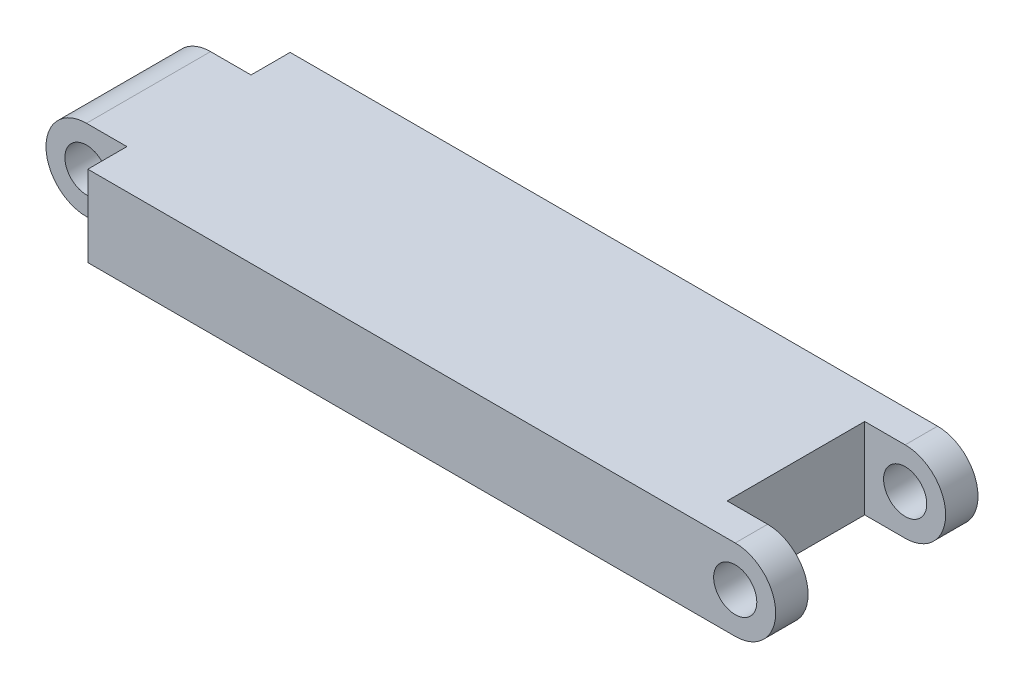
ISO-10303-21;
HEADER;
FILE_DESCRIPTION(('STEP AP214'),'2;1');
FILE_NAME('part.step','',(''),(''),'','','');
FILE_SCHEMA(('AUTOMOTIVE_DESIGN { 1 0 10303 214 1 1 1 1 }'));
ENDSEC;
DATA;
#1=APPLICATION_CONTEXT('core data for automotive mechanical design processes');
#2=APPLICATION_PROTOCOL_DEFINITION('international standard','automotive_design',2000,#1);
#3=PRODUCT_CONTEXT('',#1,'mechanical');
#4=PRODUCT('Part','Part','',(#3));
#5=PRODUCT_RELATED_PRODUCT_CATEGORY('part','',(#4));
#6=PRODUCT_DEFINITION_FORMATION('','',#4);
#7=PRODUCT_DEFINITION_CONTEXT('part definition',#1,'design');
#8=PRODUCT_DEFINITION('design','',#6,#7);
#9=PRODUCT_DEFINITION_SHAPE('','',#8);
#10=(LENGTH_UNIT() NAMED_UNIT(*) SI_UNIT(.MILLI.,.METRE.));
#11=(NAMED_UNIT(*) PLANE_ANGLE_UNIT() SI_UNIT($,.RADIAN.));
#12=(NAMED_UNIT(*) SI_UNIT($,.STERADIAN.) SOLID_ANGLE_UNIT());
#13=UNCERTAINTY_MEASURE_WITH_UNIT(LENGTH_MEASURE(1.E-05),#10,'distance_accuracy_value','');
#14=(GEOMETRIC_REPRESENTATION_CONTEXT(3) GLOBAL_UNCERTAINTY_ASSIGNED_CONTEXT((#13)) GLOBAL_UNIT_ASSIGNED_CONTEXT((#10,
#11,#12)) REPRESENTATION_CONTEXT('',''));
#15=CARTESIAN_POINT('',(0.,0.,0.));
#16=DIRECTION('',(0.,0.,1.));
#17=DIRECTION('',(1.,0.,0.));
#18=AXIS2_PLACEMENT_3D('',#15,#16,#17);
#19=CARTESIAN_POINT('',(-20.2474402730375,3.,-15.2941979522184));
#20=DIRECTION('',(0.,0.,1.));
#21=DIRECTION('',(1.,0.,0.));
#22=AXIS2_PLACEMENT_3D('',#19,#20,#21);
#23=CYLINDRICAL_SURFACE('',#22,1.6);
#24=CARTESIAN_POINT('',(-20.2474402730375,3.,1.2058020477816));
#25=DIRECTION('',(0.,0.,-1.));
#26=DIRECTION('',(-1.,0.,0.));
#27=AXIS2_PLACEMENT_3D('',#24,#25,#26);
#28=CIRCLE('',#27,1.6);
#29=CARTESIAN_POINT('',(-21.8474402730375,3.,1.2058020477816));
#30=VERTEX_POINT('',#29);
#31=EDGE_CURVE('E228',#30,#30,#28,.F.);
#32=ORIENTED_EDGE('',*,*,#31,.T.);
#33=EDGE_LOOP('',(#32));
#34=FACE_BOUND('',#33,.T.);
#35=CARTESIAN_POINT('',(-20.2474402730375,3.,-7.9941979522184));
#36=DIRECTION('',(0.,0.,-1.));
#37=DIRECTION('',(-1.,0.,0.));
#38=AXIS2_PLACEMENT_3D('',#35,#36,#37);
#39=CIRCLE('',#38,1.6);
#40=CARTESIAN_POINT('',(-21.8474402730375,3.,-7.9941979522184));
#41=VERTEX_POINT('',#40);
#42=EDGE_CURVE('E241',#41,#41,#39,.F.);
#43=ORIENTED_EDGE('',*,*,#42,.F.);
#44=EDGE_LOOP('',(#43));
#45=FACE_BOUND('',#44,.T.);
#46=ADVANCED_FACE('F104',(#34,#45),#23,.F.);
#47=CARTESIAN_POINT('',(-20.2474402730375,3.,-15.2941979522184));
#48=DIRECTION('',(0.,0.,1.));
#49=DIRECTION('',(1.,0.,0.));
#50=AXIS2_PLACEMENT_3D('',#47,#48,#49);
#51=CYLINDRICAL_SURFACE('',#50,3.);
#52=CARTESIAN_POINT('',(-20.2474402730375,3.,1.2058020477816));
#53=DIRECTION('',(0.,0.,-1.));
#54=DIRECTION('',(-1.,0.,0.));
#55=AXIS2_PLACEMENT_3D('',#52,#53,#54);
#56=CIRCLE('',#55,3.);
#57=CARTESIAN_POINT('',(-20.2474402730375,0.,1.2058020477816));
#58=VERTEX_POINT('',#57);
#59=CARTESIAN_POINT('',(-20.2474402730375,6.,1.2058020477816));
#60=VERTEX_POINT('',#59);
#61=EDGE_CURVE('E223',#58,#60,#56,.T.);
#62=ORIENTED_EDGE('',*,*,#61,.T.);
#63=DIRECTION('',(0.,0.,1.));
#64=VECTOR('',#63,1.);
#65=CARTESIAN_POINT('',(-20.2474402730375,6.,-15.2941979522184));
#66=LINE('',#65,#64);
#67=CARTESIAN_POINT('',(-20.2474402730375,6.,-7.9941979522184));
#68=VERTEX_POINT('',#67);
#69=EDGE_CURVE('E204',#68,#60,#66,.T.);
#70=ORIENTED_EDGE('',*,*,#69,.F.);
#71=CARTESIAN_POINT('',(-20.2474402730375,3.,-7.9941979522184));
#72=DIRECTION('',(0.,0.,-1.));
#73=DIRECTION('',(-1.,0.,0.));
#74=AXIS2_PLACEMENT_3D('',#71,#72,#73);
#75=CIRCLE('',#74,3.);
#76=CARTESIAN_POINT('',(-20.2474402730375,0.,-7.9941979522184));
#77=VERTEX_POINT('',#76);
#78=EDGE_CURVE('E12',#77,#68,#75,.T.);
#79=ORIENTED_EDGE('',*,*,#78,.F.);
#80=DIRECTION('',(0.,0.,1.));
#81=VECTOR('',#80,1.);
#82=CARTESIAN_POINT('',(-20.2474402730375,0.,-15.2941979522184));
#83=LINE('',#82,#81);
#84=EDGE_CURVE('E245',#77,#58,#83,.T.);
#85=ORIENTED_EDGE('',*,*,#84,.T.);
#86=EDGE_LOOP('',(#62,#70,#79,#85));
#87=FACE_BOUND('',#86,.T.);
#88=ADVANCED_FACE('F368',(#87),#51,.T.);
#89=CARTESIAN_POINT('',(-23.2474402730375,6.,4.1058020477816));
#90=DIRECTION('',(0.,0.,-1.));
#91=DIRECTION('',(-1.,0.,0.));
#92=AXIS2_PLACEMENT_3D('',#89,#90,#91);
#93=PLANE('',#92);
#94=CARTESIAN_POINT('',(30.7525597269625,3.,4.1058020477816));
#95=DIRECTION('',(0.,0.,1.));
#96=DIRECTION('',(1.,0.,0.));
#97=AXIS2_PLACEMENT_3D('',#94,#95,#96);
#98=CIRCLE('',#97,1.6);
#99=CARTESIAN_POINT('',(32.3525597269625,3.,4.1058020477816));
#100=VERTEX_POINT('',#99);
#101=EDGE_CURVE('E280',#100,#100,#98,.T.);
#102=ORIENTED_EDGE('',*,*,#101,.F.);
#103=EDGE_LOOP('',(#102));
#104=FACE_BOUND('',#103,.T.);
#105=DIRECTION('',(1.,0.,0.));
#106=VECTOR('',#105,1.);
#107=CARTESIAN_POINT('',(-23.2474402730375,6.,4.1058020477816));
#108=LINE('',#107,#106);
#109=CARTESIAN_POINT('',(-17.2474402730375,6.,4.1058020477816));
#110=VERTEX_POINT('',#109);
#111=CARTESIAN_POINT('',(30.7525597269625,6.,4.1058020477816));
#112=VERTEX_POINT('',#111);
#113=EDGE_CURVE('E329',#110,#112,#108,.T.);
#114=ORIENTED_EDGE('',*,*,#113,.F.);
#115=DIRECTION('',(0.,1.,0.));
#116=VECTOR('',#115,1.);
#117=CARTESIAN_POINT('',(-17.2474402730375,-11.,4.1058020477816));
#118=LINE('',#117,#116);
#119=CARTESIAN_POINT('',(-17.2474402730375,0.,4.1058020477816));
#120=VERTEX_POINT('',#119);
#121=EDGE_CURVE('E199',#120,#110,#118,.T.);
#122=ORIENTED_EDGE('',*,*,#121,.F.);
#123=DIRECTION('',(1.,0.,0.));
#124=VECTOR('',#123,1.);
#125=CARTESIAN_POINT('',(-23.2474402730375,0.,4.1058020477816));
#126=LINE('',#125,#124);
#127=CARTESIAN_POINT('',(30.7525597269625,0.,4.1058020477816));
#128=VERTEX_POINT('',#127);
#129=EDGE_CURVE('E326',#120,#128,#126,.T.);
#130=ORIENTED_EDGE('',*,*,#129,.T.);
#131=CARTESIAN_POINT('',(30.7525597269625,3.,4.1058020477816));
#132=DIRECTION('',(0.,0.,1.));
#133=DIRECTION('',(1.,0.,0.));
#134=AXIS2_PLACEMENT_3D('',#131,#132,#133);
#135=CIRCLE('',#134,3.);
#136=EDGE_CURVE('E272',#112,#128,#135,.F.);
#137=ORIENTED_EDGE('',*,*,#136,.F.);
#138=EDGE_LOOP('',(#114,#122,#130,#137));
#139=FACE_BOUND('',#138,.T.);
#140=ADVANCED_FACE('F106',(#104,#139),#93,.F.);
#141=CARTESIAN_POINT('',(-23.2474402730375,6.,-10.8941979522184));
#142=DIRECTION('',(0.,0.,1.));
#143=DIRECTION('',(1.,0.,0.));
#144=AXIS2_PLACEMENT_3D('',#141,#142,#143);
#145=PLANE('',#144);
#146=CARTESIAN_POINT('',(30.7525597269625,3.,-10.8941979522184));
#147=DIRECTION('',(0.,0.,1.));
#148=DIRECTION('',(1.,0.,0.));
#149=AXIS2_PLACEMENT_3D('',#146,#147,#148);
#150=CIRCLE('',#149,1.6);
#151=CARTESIAN_POINT('',(32.3525597269625,3.,-10.8941979522184));
#152=VERTEX_POINT('',#151);
#153=EDGE_CURVE('E289',#152,#152,#150,.T.);
#154=ORIENTED_EDGE('',*,*,#153,.T.);
#155=EDGE_LOOP('',(#154));
#156=FACE_BOUND('',#155,.T.);
#157=DIRECTION('',(-1.,0.,0.));
#158=VECTOR('',#157,1.);
#159=CARTESIAN_POINT('',(-23.2474402730375,0.,-10.8941979522184));
#160=LINE('',#159,#158);
#161=CARTESIAN_POINT('',(30.7525597269625,0.,-10.8941979522184));
#162=VERTEX_POINT('',#161);
#163=CARTESIAN_POINT('',(-17.2474402730375,0.,-10.8941979522184));
#164=VERTEX_POINT('',#163);
#165=EDGE_CURVE('E333',#162,#164,#160,.T.);
#166=ORIENTED_EDGE('',*,*,#165,.T.);
#167=DIRECTION('',(0.,1.,0.));
#168=VECTOR('',#167,1.);
#169=CARTESIAN_POINT('',(-17.2474402730375,-11.,-10.8941979522184));
#170=LINE('',#169,#168);
#171=CARTESIAN_POINT('',(-17.2474402730375,6.,-10.8941979522184));
#172=VERTEX_POINT('',#171);
#173=EDGE_CURVE('E254',#164,#172,#170,.T.);
#174=ORIENTED_EDGE('',*,*,#173,.T.);
#175=DIRECTION('',(-1.,0.,0.));
#176=VECTOR('',#175,1.);
#177=CARTESIAN_POINT('',(-23.2474402730375,6.,-10.8941979522184));
#178=LINE('',#177,#176);
#179=CARTESIAN_POINT('',(30.7525597269625,6.,-10.8941979522184));
#180=VERTEX_POINT('',#179);
#181=EDGE_CURVE('E332',#180,#172,#178,.T.);
#182=ORIENTED_EDGE('',*,*,#181,.F.);
#183=CARTESIAN_POINT('',(30.7525597269625,3.,-10.8941979522184));
#184=DIRECTION('',(0.,0.,1.));
#185=DIRECTION('',(1.,0.,0.));
#186=AXIS2_PLACEMENT_3D('',#183,#184,#185);
#187=CIRCLE('',#186,3.);
#188=EDGE_CURVE('E296',#180,#162,#187,.F.);
#189=ORIENTED_EDGE('',*,*,#188,.T.);
#190=EDGE_LOOP('',(#166,#174,#182,#189));
#191=FACE_BOUND('',#190,.T.);
#192=ADVANCED_FACE('F376',(#156,#191),#145,.F.);
#193=CARTESIAN_POINT('',(0.,0.,0.));
#194=DIRECTION('',(0.,1.,0.));
#195=DIRECTION('',(0.,0.,1.));
#196=AXIS2_PLACEMENT_3D('',#193,#194,#195);
#197=PLANE('',#196);
#198=DIRECTION('',(0.,0.,-1.));
#199=VECTOR('',#198,1.);
#200=CARTESIAN_POINT('',(-17.2474402730375,0.,0.));
#201=LINE('',#200,#199);
#202=CARTESIAN_POINT('',(-17.2474402730375,0.,1.2058020477816));
#203=VERTEX_POINT('',#202);
#204=EDGE_CURVE('E257',#120,#203,#201,.T.);
#205=ORIENTED_EDGE('',*,*,#204,.T.);
#206=DIRECTION('',(1.,0.,0.));
#207=VECTOR('',#206,1.);
#208=CARTESIAN_POINT('',(-17.2474402730375,0.,1.2058020477816));
#209=LINE('',#208,#207);
#210=EDGE_CURVE('E214',#58,#203,#209,.T.);
#211=ORIENTED_EDGE('',*,*,#210,.F.);
#212=ORIENTED_EDGE('',*,*,#84,.F.);
#213=DIRECTION('',(-1.,0.,0.));
#214=VECTOR('',#213,1.);
#215=CARTESIAN_POINT('',(-17.2474402730375,0.,-7.9941979522184));
#216=LINE('',#215,#214);
#217=CARTESIAN_POINT('',(-17.2474402730375,0.,-7.9941979522184));
#218=VERTEX_POINT('',#217);
#219=EDGE_CURVE('E119',#218,#77,#216,.T.);
#220=ORIENTED_EDGE('',*,*,#219,.F.);
#221=DIRECTION('',(0.,0.,-1.));
#222=VECTOR('',#221,1.);
#223=CARTESIAN_POINT('',(-17.2474402730375,0.,0.));
#224=LINE('',#223,#222);
#225=EDGE_CURVE('E263',#218,#164,#224,.T.);
#226=ORIENTED_EDGE('',*,*,#225,.T.);
#227=ORIENTED_EDGE('',*,*,#165,.F.);
#228=DIRECTION('',(0.,0.,1.));
#229=VECTOR('',#228,1.);
#230=CARTESIAN_POINT('',(30.7525597269625,0.,-12.8941979522184));
#231=LINE('',#230,#229);
#232=CARTESIAN_POINT('',(30.7525597269625,0.,-8.4941979522184));
#233=VERTEX_POINT('',#232);
#234=EDGE_CURVE('E271',#162,#233,#231,.T.);
#235=ORIENTED_EDGE('',*,*,#234,.T.);
#236=DIRECTION('',(-1.,0.,0.));
#237=VECTOR('',#236,1.);
#238=CARTESIAN_POINT('',(27.7525597269625,0.,-8.4941979522184));
#239=LINE('',#238,#237);
#240=CARTESIAN_POINT('',(27.7525597269625,0.,-8.4941979522184));
#241=VERTEX_POINT('',#240);
#242=EDGE_CURVE('E309',#233,#241,#239,.T.);
#243=ORIENTED_EDGE('',*,*,#242,.T.);
#244=DIRECTION('',(0.,0.,1.));
#245=VECTOR('',#244,1.);
#246=CARTESIAN_POINT('',(27.7525597269625,0.,-8.4941979522184));
#247=LINE('',#246,#245);
#248=CARTESIAN_POINT('',(27.7525597269625,0.,1.7058020477816));
#249=VERTEX_POINT('',#248);
#250=EDGE_CURVE('E300',#241,#249,#247,.T.);
#251=ORIENTED_EDGE('',*,*,#250,.T.);
#252=DIRECTION('',(1.,0.,0.));
#253=VECTOR('',#252,1.);
#254=CARTESIAN_POINT('',(27.7525597269625,0.,1.7058020477816));
#255=LINE('',#254,#253);
#256=CARTESIAN_POINT('',(30.7525597269625,0.,1.7058020477816));
#257=VERTEX_POINT('',#256);
#258=EDGE_CURVE('E304',#249,#257,#255,.T.);
#259=ORIENTED_EDGE('',*,*,#258,.T.);
#260=EDGE_CURVE('E267',#257,#128,#231,.T.);
#261=ORIENTED_EDGE('',*,*,#260,.T.);
#262=ORIENTED_EDGE('',*,*,#129,.F.);
#263=EDGE_LOOP('',(#205,#211,#212,#220,#226,#227,#235,#243,#251,#259,#261,#262));
#264=FACE_BOUND('',#263,.T.);
#265=ADVANCED_FACE('F356',(#264),#197,.F.);
#266=CARTESIAN_POINT('',(27.7525597269625,0.,-8.4941979522184));
#267=DIRECTION('',(0.,0.,-1.));
#268=DIRECTION('',(-1.,0.,0.));
#269=AXIS2_PLACEMENT_3D('',#266,#267,#268);
#270=PLANE('',#269);
#271=CARTESIAN_POINT('',(30.7525597269625,3.,-8.4941979522184));
#272=DIRECTION('',(0.,0.,-1.));
#273=DIRECTION('',(-1.,0.,0.));
#274=AXIS2_PLACEMENT_3D('',#271,#272,#273);
#275=CIRCLE('',#274,1.6);
#276=CARTESIAN_POINT('',(29.1525597269625,3.,-8.4941979522184));
#277=VERTEX_POINT('',#276);
#278=EDGE_CURVE('E285',#277,#277,#275,.T.);
#279=ORIENTED_EDGE('',*,*,#278,.T.);
#280=EDGE_LOOP('',(#279));
#281=FACE_BOUND('',#280,.T.);
#282=ORIENTED_EDGE('',*,*,#242,.F.);
#283=CARTESIAN_POINT('',(30.7525597269625,3.,-8.4941979522184));
#284=DIRECTION('',(0.,0.,-1.));
#285=DIRECTION('',(-1.,0.,0.));
#286=AXIS2_PLACEMENT_3D('',#283,#284,#285);
#287=CIRCLE('',#286,3.);
#288=CARTESIAN_POINT('',(30.7525597269625,6.,-8.4941979522184));
#289=VERTEX_POINT('',#288);
#290=EDGE_CURVE('E293',#233,#289,#287,.F.);
#291=ORIENTED_EDGE('',*,*,#290,.T.);
#292=DIRECTION('',(-1.,0.,0.));
#293=VECTOR('',#292,1.);
#294=CARTESIAN_POINT('',(27.7525597269625,6.,-8.4941979522184));
#295=LINE('',#294,#293);
#296=CARTESIAN_POINT('',(27.7525597269625,6.,-8.4941979522184));
#297=VERTEX_POINT('',#296);
#298=EDGE_CURVE('E305',#289,#297,#295,.T.);
#299=ORIENTED_EDGE('',*,*,#298,.T.);
#300=DIRECTION('',(0.,1.,0.));
#301=VECTOR('',#300,1.);
#302=CARTESIAN_POINT('',(27.7525597269625,0.,-8.4941979522184));
#303=LINE('',#302,#301);
#304=EDGE_CURVE('E322',#241,#297,#303,.T.);
#305=ORIENTED_EDGE('',*,*,#304,.F.);
#306=EDGE_LOOP('',(#282,#291,#299,#305));
#307=FACE_BOUND('',#306,.T.);
#308=ADVANCED_FACE('F381',(#281,#307),#270,.F.);
#309=CARTESIAN_POINT('',(27.7525597269625,0.,1.7058020477816));
#310=DIRECTION('',(0.,0.,1.));
#311=DIRECTION('',(1.,0.,0.));
#312=AXIS2_PLACEMENT_3D('',#309,#310,#311);
#313=PLANE('',#312);
#314=CARTESIAN_POINT('',(30.7525597269625,3.,1.7058020477816));
#315=DIRECTION('',(0.,0.,1.));
#316=DIRECTION('',(1.,0.,0.));
#317=AXIS2_PLACEMENT_3D('',#314,#315,#316);
#318=CIRCLE('',#317,1.6);
#319=CARTESIAN_POINT('',(32.3525597269625,3.,1.7058020477816));
#320=VERTEX_POINT('',#319);
#321=EDGE_CURVE('E284',#320,#320,#318,.T.);
#322=ORIENTED_EDGE('',*,*,#321,.T.);
#323=EDGE_LOOP('',(#322));
#324=FACE_BOUND('',#323,.T.);
#325=CARTESIAN_POINT('',(30.7525597269625,3.,1.7058020477816));
#326=DIRECTION('',(0.,0.,1.));
#327=DIRECTION('',(1.,0.,0.));
#328=AXIS2_PLACEMENT_3D('',#325,#326,#327);
#329=CIRCLE('',#328,3.);
#330=CARTESIAN_POINT('',(30.7525597269625,6.,1.7058020477816));
#331=VERTEX_POINT('',#330);
#332=EDGE_CURVE('E113',#331,#257,#329,.F.);
#333=ORIENTED_EDGE('',*,*,#332,.T.);
#334=ORIENTED_EDGE('',*,*,#258,.F.);
#335=DIRECTION('',(0.,1.,0.));
#336=VECTOR('',#335,1.);
#337=CARTESIAN_POINT('',(27.7525597269625,0.,1.7058020477816));
#338=LINE('',#337,#336);
#339=CARTESIAN_POINT('',(27.7525597269625,6.,1.7058020477816));
#340=VERTEX_POINT('',#339);
#341=EDGE_CURVE('E312',#249,#340,#338,.T.);
#342=ORIENTED_EDGE('',*,*,#341,.T.);
#343=DIRECTION('',(1.,0.,0.));
#344=VECTOR('',#343,1.);
#345=CARTESIAN_POINT('',(27.7525597269625,6.,1.7058020477816));
#346=LINE('',#345,#344);
#347=EDGE_CURVE('E316',#340,#331,#346,.T.);
#348=ORIENTED_EDGE('',*,*,#347,.T.);
#349=EDGE_LOOP('',(#333,#334,#342,#348));
#350=FACE_BOUND('',#349,.T.);
#351=ADVANCED_FACE('F348',(#324,#350),#313,.F.);
#352=CARTESIAN_POINT('',(0.,6.,0.));
#353=DIRECTION('',(0.,1.,0.));
#354=DIRECTION('',(0.,0.,1.));
#355=AXIS2_PLACEMENT_3D('',#352,#353,#354);
#356=PLANE('',#355);
#357=DIRECTION('',(-1.,0.,0.));
#358=VECTOR('',#357,1.);
#359=CARTESIAN_POINT('',(-17.2474402730375,6.,1.2058020477816));
#360=LINE('',#359,#358);
#361=CARTESIAN_POINT('',(-17.2474402730375,6.,1.2058020477816));
#362=VERTEX_POINT('',#361);
#363=EDGE_CURVE('E211',#362,#60,#360,.T.);
#364=ORIENTED_EDGE('',*,*,#363,.F.);
#365=DIRECTION('',(0.,0.,-1.));
#366=VECTOR('',#365,1.);
#367=CARTESIAN_POINT('',(-17.2474402730375,6.,4.1058020477816));
#368=LINE('',#367,#366);
#369=EDGE_CURVE('E194',#110,#362,#368,.T.);
#370=ORIENTED_EDGE('',*,*,#369,.F.);
#371=ORIENTED_EDGE('',*,*,#113,.T.);
#372=DIRECTION('',(0.,0.,1.));
#373=VECTOR('',#372,1.);
#374=CARTESIAN_POINT('',(30.7525597269625,6.,-12.8941979522184));
#375=LINE('',#374,#373);
#376=EDGE_CURVE('E276',#331,#112,#375,.T.);
#377=ORIENTED_EDGE('',*,*,#376,.F.);
#378=ORIENTED_EDGE('',*,*,#347,.F.);
#379=DIRECTION('',(0.,0.,1.));
#380=VECTOR('',#379,1.);
#381=CARTESIAN_POINT('',(27.7525597269625,6.,-8.4941979522184));
#382=LINE('',#381,#380);
#383=EDGE_CURVE('E299',#297,#340,#382,.T.);
#384=ORIENTED_EDGE('',*,*,#383,.F.);
#385=ORIENTED_EDGE('',*,*,#298,.F.);
#386=EDGE_CURVE('E127',#180,#289,#375,.T.);
#387=ORIENTED_EDGE('',*,*,#386,.F.);
#388=ORIENTED_EDGE('',*,*,#181,.T.);
#389=DIRECTION('',(0.,0.,-1.));
#390=VECTOR('',#389,1.);
#391=CARTESIAN_POINT('',(-17.2474402730375,6.,-10.8941979522184));
#392=LINE('',#391,#390);
#393=CARTESIAN_POINT('',(-17.2474402730375,6.,-7.9941979522184));
#394=VERTEX_POINT('',#393);
#395=EDGE_CURVE('E251',#394,#172,#392,.T.);
#396=ORIENTED_EDGE('',*,*,#395,.F.);
#397=DIRECTION('',(1.,0.,0.));
#398=VECTOR('',#397,1.);
#399=CARTESIAN_POINT('',(-17.2474402730375,6.,-7.9941979522184));
#400=LINE('',#399,#398);
#401=EDGE_CURVE('E237',#68,#394,#400,.T.);
#402=ORIENTED_EDGE('',*,*,#401,.F.);
#403=ORIENTED_EDGE('',*,*,#69,.T.);
#404=EDGE_LOOP('',(#364,#370,#371,#377,#378,#384,#385,#387,#388,#396,#402,#403));
#405=FACE_BOUND('',#404,.T.);
#406=ADVANCED_FACE('F217',(#405),#356,.T.);
#407=CARTESIAN_POINT('',(27.7525597269625,0.,-8.4941979522184));
#408=DIRECTION('',(-1.,0.,0.));
#409=DIRECTION('',(0.,0.,1.));
#410=AXIS2_PLACEMENT_3D('',#407,#408,#409);
#411=PLANE('',#410);
#412=ORIENTED_EDGE('',*,*,#383,.T.);
#413=ORIENTED_EDGE('',*,*,#341,.F.);
#414=ORIENTED_EDGE('',*,*,#250,.F.);
#415=ORIENTED_EDGE('',*,*,#304,.T.);
#416=EDGE_LOOP('',(#412,#413,#414,#415));
#417=FACE_BOUND('',#416,.T.);
#418=ADVANCED_FACE('F362',(#417),#411,.F.);
#419=CARTESIAN_POINT('',(30.7525597269625,3.,-12.8941979522184));
#420=DIRECTION('',(0.,0.,1.));
#421=DIRECTION('',(1.,0.,0.));
#422=AXIS2_PLACEMENT_3D('',#419,#420,#421);
#423=CYLINDRICAL_SURFACE('',#422,1.6);
#424=ORIENTED_EDGE('',*,*,#101,.T.);
#425=EDGE_LOOP('',(#424));
#426=FACE_BOUND('',#425,.T.);
#427=ORIENTED_EDGE('',*,*,#321,.F.);
#428=EDGE_LOOP('',(#427));
#429=FACE_BOUND('',#428,.T.);
#430=ADVANCED_FACE('F395',(#426,#429),#423,.F.);
#431=CARTESIAN_POINT('',(30.7525597269625,3.,-12.8941979522184));
#432=DIRECTION('',(0.,0.,1.));
#433=DIRECTION('',(1.,0.,0.));
#434=AXIS2_PLACEMENT_3D('',#431,#432,#433);
#435=CYLINDRICAL_SURFACE('',#434,3.);
#436=ORIENTED_EDGE('',*,*,#376,.T.);
#437=ORIENTED_EDGE('',*,*,#136,.T.);
#438=ORIENTED_EDGE('',*,*,#260,.F.);
#439=ORIENTED_EDGE('',*,*,#332,.F.);
#440=EDGE_LOOP('',(#436,#437,#438,#439));
#441=FACE_BOUND('',#440,.T.);
#442=ADVANCED_FACE('F352',(#441),#435,.T.);
#443=ORIENTED_EDGE('',*,*,#278,.F.);
#444=EDGE_LOOP('',(#443));
#445=FACE_BOUND('',#444,.T.);
#446=ORIENTED_EDGE('',*,*,#153,.F.);
#447=EDGE_LOOP('',(#446));
#448=FACE_BOUND('',#447,.T.);
#449=ADVANCED_FACE('F385',(#445,#448),#423,.F.);
#450=ORIENTED_EDGE('',*,*,#386,.T.);
#451=ORIENTED_EDGE('',*,*,#290,.F.);
#452=ORIENTED_EDGE('',*,*,#234,.F.);
#453=ORIENTED_EDGE('',*,*,#188,.F.);
#454=EDGE_LOOP('',(#450,#451,#452,#453));
#455=FACE_BOUND('',#454,.T.);
#456=ADVANCED_FACE('F383',(#455),#435,.T.);
#457=CARTESIAN_POINT('',(-17.2474402730375,-11.,4.1058020477816));
#458=DIRECTION('',(1.,0.,0.));
#459=DIRECTION('',(0.,0.,-1.));
#460=AXIS2_PLACEMENT_3D('',#457,#458,#459);
#461=PLANE('',#460);
#462=ORIENTED_EDGE('',*,*,#121,.T.);
#463=ORIENTED_EDGE('',*,*,#369,.T.);
#464=DIRECTION('',(0.,1.,0.));
#465=VECTOR('',#464,1.);
#466=CARTESIAN_POINT('',(-17.2474402730375,6.,1.2058020477816));
#467=LINE('',#466,#465);
#468=EDGE_CURVE('E197',#203,#362,#467,.T.);
#469=ORIENTED_EDGE('',*,*,#468,.F.);
#470=ORIENTED_EDGE('',*,*,#204,.F.);
#471=EDGE_LOOP('',(#462,#463,#469,#470));
#472=FACE_BOUND('',#471,.T.);
#473=ADVANCED_FACE('F196',(#472),#461,.F.);
#474=CARTESIAN_POINT('',(-17.2474402730375,-11.,-10.8941979522184));
#475=DIRECTION('',(1.,0.,0.));
#476=DIRECTION('',(0.,0.,-1.));
#477=AXIS2_PLACEMENT_3D('',#474,#475,#476);
#478=PLANE('',#477);
#479=ORIENTED_EDGE('',*,*,#225,.F.);
#480=DIRECTION('',(0.,-1.,0.));
#481=VECTOR('',#480,1.);
#482=CARTESIAN_POINT('',(-17.2474402730375,6.,-7.9941979522184));
#483=LINE('',#482,#481);
#484=EDGE_CURVE('E232',#394,#218,#483,.T.);
#485=ORIENTED_EDGE('',*,*,#484,.F.);
#486=ORIENTED_EDGE('',*,*,#395,.T.);
#487=ORIENTED_EDGE('',*,*,#173,.F.);
#488=EDGE_LOOP('',(#479,#485,#486,#487));
#489=FACE_BOUND('',#488,.T.);
#490=ADVANCED_FACE('F374',(#489),#478,.F.);
#491=CARTESIAN_POINT('',(0.,0.,-7.9941979522184));
#492=DIRECTION('',(0.,0.,-1.));
#493=DIRECTION('',(-1.,0.,0.));
#494=AXIS2_PLACEMENT_3D('',#491,#492,#493);
#495=PLANE('',#494);
#496=ORIENTED_EDGE('',*,*,#78,.T.);
#497=ORIENTED_EDGE('',*,*,#401,.T.);
#498=ORIENTED_EDGE('',*,*,#484,.T.);
#499=ORIENTED_EDGE('',*,*,#219,.T.);
#500=EDGE_LOOP('',(#496,#497,#498,#499));
#501=FACE_BOUND('',#500,.T.);
#502=ORIENTED_EDGE('',*,*,#42,.T.);
#503=EDGE_LOOP('',(#502));
#504=FACE_BOUND('',#503,.T.);
#505=ADVANCED_FACE('F369',(#501,#504),#495,.T.);
#506=CARTESIAN_POINT('',(0.,0.,1.2058020477816));
#507=DIRECTION('',(0.,0.,-1.));
#508=DIRECTION('',(-1.,0.,0.));
#509=AXIS2_PLACEMENT_3D('',#506,#507,#508);
#510=PLANE('',#509);
#511=ORIENTED_EDGE('',*,*,#61,.F.);
#512=ORIENTED_EDGE('',*,*,#210,.T.);
#513=ORIENTED_EDGE('',*,*,#468,.T.);
#514=ORIENTED_EDGE('',*,*,#363,.T.);
#515=EDGE_LOOP('',(#511,#512,#513,#514));
#516=FACE_BOUND('',#515,.T.);
#517=ORIENTED_EDGE('',*,*,#31,.F.);
#518=EDGE_LOOP('',(#517));
#519=FACE_BOUND('',#518,.T.);
#520=ADVANCED_FACE('F209',(#516,#519),#510,.F.);
#521=CLOSED_SHELL('',(#46,#88,#140,#192,#265,#308,#351,#406,#418,#430,#442,#449,#456,#473,#490,
#505,#520));
#522=MANIFOLD_SOLID_BREP('B2',#521);
#523=ADVANCED_BREP_SHAPE_REPRESENTATION('',(#18,#522),#14);
#524=SHAPE_DEFINITION_REPRESENTATION(#9,#523);
ENDSEC;
END-ISO-10303-21;
